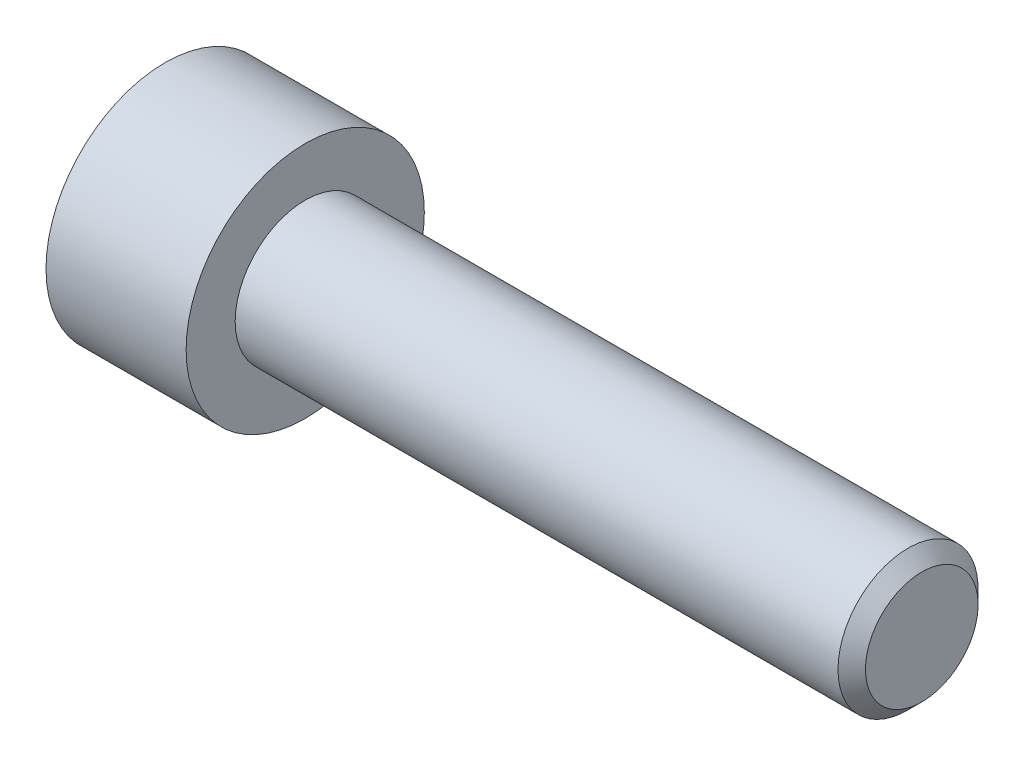
ISO-10303-21;
HEADER;
FILE_DESCRIPTION(('STEP AP214'),'2;1');
FILE_NAME('part.step','',(''),(''),'','','');
FILE_SCHEMA(('AUTOMOTIVE_DESIGN { 1 0 10303 214 1 1 1 1 }'));
ENDSEC;
DATA;
#1=APPLICATION_CONTEXT('core data for automotive mechanical design processes');
#2=APPLICATION_PROTOCOL_DEFINITION('international standard','automotive_design',2000,#1);
#3=PRODUCT_CONTEXT('',#1,'mechanical');
#4=PRODUCT('Part','Part','',(#3));
#5=PRODUCT_RELATED_PRODUCT_CATEGORY('part','',(#4));
#6=PRODUCT_DEFINITION_FORMATION('','',#4);
#7=PRODUCT_DEFINITION_CONTEXT('part definition',#1,'design');
#8=PRODUCT_DEFINITION('design','',#6,#7);
#9=PRODUCT_DEFINITION_SHAPE('','',#8);
#10=(LENGTH_UNIT() NAMED_UNIT(*) SI_UNIT(.MILLI.,.METRE.));
#11=(NAMED_UNIT(*) PLANE_ANGLE_UNIT() SI_UNIT($,.RADIAN.));
#12=(NAMED_UNIT(*) SI_UNIT($,.STERADIAN.) SOLID_ANGLE_UNIT());
#13=UNCERTAINTY_MEASURE_WITH_UNIT(LENGTH_MEASURE(1.E-05),#10,'distance_accuracy_value','');
#14=(GEOMETRIC_REPRESENTATION_CONTEXT(3) GLOBAL_UNCERTAINTY_ASSIGNED_CONTEXT((#13)) GLOBAL_UNIT_ASSIGNED_CONTEXT((#10,
#11,#12)) REPRESENTATION_CONTEXT('',''));
#15=CARTESIAN_POINT('',(0.,0.,0.));
#16=DIRECTION('',(0.,0.,1.));
#17=DIRECTION('',(1.,0.,0.));
#18=AXIS2_PLACEMENT_3D('',#15,#16,#17);
#19=CARTESIAN_POINT('',(-2.5,0.,0.));
#20=DIRECTION('',(1.,0.,0.));
#21=DIRECTION('',(0.,0.,-1.));
#22=AXIS2_PLACEMENT_3D('',#19,#20,#21);
#23=PLANE('',#22);
#24=DIRECTION('',(0.,-0.5,-0.866025403784439));
#25=VECTOR('',#24,1.);
#26=CARTESIAN_POINT('',(-2.5,-1.15470053837925,2.));
#27=LINE('',#26,#25);
#28=CARTESIAN_POINT('',(-2.5,-1.15470053837925,2.));
#29=VERTEX_POINT('',#28);
#30=CARTESIAN_POINT('',(-2.49999999999886,-1.73205080757302,1.00000000000238));
#31=VERTEX_POINT('',#30);
#32=EDGE_CURVE('E93',#29,#31,#27,.T.);
#33=ORIENTED_EDGE('',*,*,#32,.F.);
#34=DIRECTION('',(0.,1.,0.));
#35=VECTOR('',#34,1.);
#36=CARTESIAN_POINT('',(-2.5,0.,2.));
#37=LINE('',#36,#35);
#38=CARTESIAN_POINT('',(-2.49999999999886,0.,2.00000000000477));
#39=VERTEX_POINT('',#38);
#40=EDGE_CURVE('E89',#39,#29,#37,.F.);
#41=ORIENTED_EDGE('',*,*,#40,.F.);
#42=CARTESIAN_POINT('',(-2.49999999999773,0.,0.));
#43=DIRECTION('',(-1.,0.,0.));
#44=DIRECTION('',(0.,0.,1.));
#45=AXIS2_PLACEMENT_3D('',#42,#43,#44);
#46=CIRCLE('',#45,2.00000000000955);
#47=EDGE_CURVE('E20',#39,#31,#46,.F.);
#48=ORIENTED_EDGE('',*,*,#47,.T.);
#49=EDGE_LOOP('',(#33,#41,#48));
#50=FACE_BOUND('',#49,.T.);
#51=ADVANCED_FACE('F17',(#50),#23,.F.);
#52=CARTESIAN_POINT('',(-2.5,0.,0.));
#53=DIRECTION('',(1.,0.,0.));
#54=DIRECTION('',(0.,0.,-1.));
#55=AXIS2_PLACEMENT_3D('',#52,#53,#54);
#56=PLANE('',#55);
#57=DIRECTION('',(0.,0.499999999999999,-0.866025403784439));
#58=VECTOR('',#57,1.);
#59=CARTESIAN_POINT('',(-2.5,-2.3094010767585,0.));
#60=LINE('',#59,#58);
#61=CARTESIAN_POINT('',(-2.5,-2.3094010767585,0.));
#62=VERTEX_POINT('',#61);
#63=CARTESIAN_POINT('',(-2.49999999999886,-1.73205080757301,-1.0000000000024));
#64=VERTEX_POINT('',#63);
#65=EDGE_CURVE('E163',#62,#64,#60,.T.);
#66=ORIENTED_EDGE('',*,*,#65,.F.);
#67=DIRECTION('',(0.,-0.5,-0.866025403784439));
#68=VECTOR('',#67,1.);
#69=CARTESIAN_POINT('',(-2.5,-1.73205080756888,0.999999999999991));
#70=LINE('',#69,#68);
#71=EDGE_CURVE('E167',#31,#62,#70,.T.);
#72=ORIENTED_EDGE('',*,*,#71,.F.);
#73=CARTESIAN_POINT('',(-2.49999999999773,0.,0.));
#74=DIRECTION('',(-1.,0.,0.));
#75=DIRECTION('',(0.,0.,1.));
#76=AXIS2_PLACEMENT_3D('',#73,#74,#75);
#77=CIRCLE('',#76,2.00000000000955);
#78=EDGE_CURVE('E108',#31,#64,#77,.F.);
#79=ORIENTED_EDGE('',*,*,#78,.T.);
#80=EDGE_LOOP('',(#66,#72,#79));
#81=FACE_BOUND('',#80,.T.);
#82=ADVANCED_FACE('F210',(#81),#56,.F.);
#83=CARTESIAN_POINT('',(-2.5,0.,0.));
#84=DIRECTION('',(1.,0.,0.));
#85=DIRECTION('',(0.,0.,-1.));
#86=AXIS2_PLACEMENT_3D('',#83,#84,#85);
#87=PLANE('',#86);
#88=DIRECTION('',(0.,1.,0.));
#89=VECTOR('',#88,1.);
#90=CARTESIAN_POINT('',(-2.5,0.,-2.));
#91=LINE('',#90,#89);
#92=CARTESIAN_POINT('',(-2.5,-1.15470053837925,-2.));
#93=VERTEX_POINT('',#92);
#94=CARTESIAN_POINT('',(-2.49999999999886,0.,-2.00000000000477));
#95=VERTEX_POINT('',#94);
#96=EDGE_CURVE('E109',#93,#95,#91,.T.);
#97=ORIENTED_EDGE('',*,*,#96,.F.);
#98=DIRECTION('',(0.,0.5,-0.866025403784439));
#99=VECTOR('',#98,1.);
#100=CARTESIAN_POINT('',(-2.5,-1.73205080756887,-1.00000000000001));
#101=LINE('',#100,#99);
#102=EDGE_CURVE('E159',#64,#93,#101,.T.);
#103=ORIENTED_EDGE('',*,*,#102,.F.);
#104=CARTESIAN_POINT('',(-2.49999999999773,0.,0.));
#105=DIRECTION('',(-1.,0.,0.));
#106=DIRECTION('',(0.,0.,1.));
#107=AXIS2_PLACEMENT_3D('',#104,#105,#106);
#108=CIRCLE('',#107,2.00000000000955);
#109=EDGE_CURVE('E144',#64,#95,#108,.F.);
#110=ORIENTED_EDGE('',*,*,#109,.T.);
#111=EDGE_LOOP('',(#97,#103,#110));
#112=FACE_BOUND('',#111,.T.);
#113=ADVANCED_FACE('F213',(#112),#87,.F.);
#114=CARTESIAN_POINT('',(-2.5,0.,0.));
#115=DIRECTION('',(1.,0.,0.));
#116=DIRECTION('',(0.,0.,-1.));
#117=AXIS2_PLACEMENT_3D('',#114,#115,#116);
#118=PLANE('',#117);
#119=DIRECTION('',(0.,0.5,0.866025403784439));
#120=VECTOR('',#119,1.);
#121=CARTESIAN_POINT('',(-2.5,1.15470053837925,-2.));
#122=LINE('',#121,#120);
#123=CARTESIAN_POINT('',(-2.5,1.15470053837925,-2.));
#124=VERTEX_POINT('',#123);
#125=CARTESIAN_POINT('',(-2.49999999999886,1.73205080757302,-1.00000000000238));
#126=VERTEX_POINT('',#125);
#127=EDGE_CURVE('E136',#124,#126,#122,.T.);
#128=ORIENTED_EDGE('',*,*,#127,.F.);
#129=DIRECTION('',(0.,1.,0.));
#130=VECTOR('',#129,1.);
#131=CARTESIAN_POINT('',(-2.5,0.,-2.));
#132=LINE('',#131,#130);
#133=EDGE_CURVE('E140',#95,#124,#132,.T.);
#134=ORIENTED_EDGE('',*,*,#133,.F.);
#135=CARTESIAN_POINT('',(-2.49999999999773,0.,0.));
#136=DIRECTION('',(-1.,0.,0.));
#137=DIRECTION('',(0.,0.,1.));
#138=AXIS2_PLACEMENT_3D('',#135,#136,#137);
#139=CIRCLE('',#138,2.00000000000955);
#140=EDGE_CURVE('E131',#95,#126,#139,.F.);
#141=ORIENTED_EDGE('',*,*,#140,.T.);
#142=EDGE_LOOP('',(#128,#134,#141));
#143=FACE_BOUND('',#142,.T.);
#144=ADVANCED_FACE('F220',(#143),#118,.F.);
#145=CARTESIAN_POINT('',(-2.5,0.,0.));
#146=DIRECTION('',(1.,0.,0.));
#147=DIRECTION('',(0.,0.,-1.));
#148=AXIS2_PLACEMENT_3D('',#145,#146,#147);
#149=PLANE('',#148);
#150=CARTESIAN_POINT('',(-2.49999999999773,0.,0.));
#151=DIRECTION('',(-1.,0.,0.));
#152=DIRECTION('',(0.,0.,1.));
#153=AXIS2_PLACEMENT_3D('',#150,#151,#152);
#154=CIRCLE('',#153,2.00000000000955);
#155=CARTESIAN_POINT('',(-2.49999999999886,1.73205080757301,1.0000000000024));
#156=VERTEX_POINT('',#155);
#157=EDGE_CURVE('E116',#126,#156,#154,.F.);
#158=ORIENTED_EDGE('',*,*,#157,.T.);
#159=DIRECTION('',(0.,-0.499999999999999,0.866025403784439));
#160=VECTOR('',#159,1.);
#161=CARTESIAN_POINT('',(-2.5,2.3094010767585,0.));
#162=LINE('',#161,#160);
#163=CARTESIAN_POINT('',(-2.5,2.3094010767585,0.));
#164=VERTEX_POINT('',#163);
#165=EDGE_CURVE('E132',#164,#156,#162,.T.);
#166=ORIENTED_EDGE('',*,*,#165,.F.);
#167=DIRECTION('',(0.,0.499999999999999,0.866025403784439));
#168=VECTOR('',#167,1.);
#169=CARTESIAN_POINT('',(-2.5,1.73205080756888,-0.999999999999991));
#170=LINE('',#169,#168);
#171=EDGE_CURVE('E129',#126,#164,#170,.T.);
#172=ORIENTED_EDGE('',*,*,#171,.F.);
#173=EDGE_LOOP('',(#158,#166,#172));
#174=FACE_BOUND('',#173,.T.);
#175=ADVANCED_FACE('F223',(#174),#149,.F.);
#176=CARTESIAN_POINT('',(-2.49999999999773,0.,0.));
#177=DIRECTION('',(-1.,0.,0.));
#178=DIRECTION('',(0.,0.,1.));
#179=AXIS2_PLACEMENT_3D('',#176,#177,#178);
#180=CONICAL_SURFACE('',#179,2.00000000000955,1.30899693893931);
#181=CARTESIAN_POINT('',(-1.96410161511551,0.,5.11590769747272E-10));
#182=VERTEX_POINT('',#181);
#183=VERTEX_LOOP('',#182);
#184=FACE_BOUND('',#183,.T.);
#185=ORIENTED_EDGE('',*,*,#157,.F.);
#186=ORIENTED_EDGE('',*,*,#140,.F.);
#187=ORIENTED_EDGE('',*,*,#109,.F.);
#188=ORIENTED_EDGE('',*,*,#78,.F.);
#189=ORIENTED_EDGE('',*,*,#47,.F.);
#190=CARTESIAN_POINT('',(-2.49999999999773,0.,0.));
#191=DIRECTION('',(-1.,0.,0.));
#192=DIRECTION('',(0.,0.,1.));
#193=AXIS2_PLACEMENT_3D('',#190,#191,#192);
#194=CIRCLE('',#193,2.00000000000955);
#195=EDGE_CURVE('E104',#39,#156,#194,.T.);
#196=ORIENTED_EDGE('',*,*,#195,.T.);
#197=EDGE_LOOP('',(#185,#186,#187,#188,#189,#196));
#198=FACE_BOUND('',#197,.T.);
#199=ADVANCED_FACE('F103',(#184,#198),#180,.F.);
#200=CARTESIAN_POINT('',(-2.5,0.,0.));
#201=DIRECTION('',(1.,0.,0.));
#202=DIRECTION('',(0.,0.,-1.));
#203=AXIS2_PLACEMENT_3D('',#200,#201,#202);
#204=PLANE('',#203);
#205=DIRECTION('',(0.,1.,0.));
#206=VECTOR('',#205,1.);
#207=CARTESIAN_POINT('',(-2.5,1.15470053837925,2.));
#208=LINE('',#207,#206);
#209=CARTESIAN_POINT('',(-2.5,1.15470053837925,2.));
#210=VERTEX_POINT('',#209);
#211=EDGE_CURVE('E112',#210,#39,#208,.F.);
#212=ORIENTED_EDGE('',*,*,#211,.F.);
#213=DIRECTION('',(0.,0.5,-0.866025403784439));
#214=VECTOR('',#213,1.);
#215=CARTESIAN_POINT('',(-2.5,2.3094010767585,0.));
#216=LINE('',#215,#214);
#217=EDGE_CURVE('E115',#156,#210,#216,.F.);
#218=ORIENTED_EDGE('',*,*,#217,.F.);
#219=ORIENTED_EDGE('',*,*,#195,.F.);
#220=EDGE_LOOP('',(#212,#218,#219));
#221=FACE_BOUND('',#220,.T.);
#222=ADVANCED_FACE('F111',(#221),#204,.F.);
#223=CARTESIAN_POINT('',(-2.5,1.15470053837925,2.));
#224=DIRECTION('',(0.,0.,-1.));
#225=DIRECTION('',(-1.,0.,0.));
#226=AXIS2_PLACEMENT_3D('',#223,#224,#225);
#227=PLANE('',#226);
#228=ORIENTED_EDGE('',*,*,#40,.T.);
#229=DIRECTION('',(1.,0.,0.));
#230=VECTOR('',#229,1.);
#231=CARTESIAN_POINT('',(-2.5,-1.15470053837925,2.));
#232=LINE('',#231,#230);
#233=CARTESIAN_POINT('',(-5.,-1.15470053837925,2.));
#234=VERTEX_POINT('',#233);
#235=EDGE_CURVE('E179',#234,#29,#232,.T.);
#236=ORIENTED_EDGE('',*,*,#235,.F.);
#237=DIRECTION('',(0.,1.,0.));
#238=VECTOR('',#237,1.);
#239=CARTESIAN_POINT('',(-5.,0.,2.));
#240=LINE('',#239,#238);
#241=CARTESIAN_POINT('',(-5.,1.15470053837925,2.));
#242=VERTEX_POINT('',#241);
#243=EDGE_CURVE('E184',#234,#242,#240,.T.);
#244=ORIENTED_EDGE('',*,*,#243,.T.);
#245=DIRECTION('',(1.,0.,0.));
#246=VECTOR('',#245,1.);
#247=CARTESIAN_POINT('',(-2.5,1.15470053837925,2.));
#248=LINE('',#247,#246);
#249=EDGE_CURVE('E120',#210,#242,#248,.F.);
#250=ORIENTED_EDGE('',*,*,#249,.F.);
#251=ORIENTED_EDGE('',*,*,#211,.T.);
#252=EDGE_LOOP('',(#228,#236,#244,#250,#251));
#253=FACE_BOUND('',#252,.T.);
#254=ADVANCED_FACE('F118',(#253),#227,.T.);
#255=CARTESIAN_POINT('',(-2.5,2.3094010767585,0.));
#256=DIRECTION('',(0.,-0.866025403784439,-0.5));
#257=DIRECTION('',(0.,0.5,-0.866025403784439));
#258=AXIS2_PLACEMENT_3D('',#255,#256,#257);
#259=PLANE('',#258);
#260=ORIENTED_EDGE('',*,*,#217,.T.);
#261=ORIENTED_EDGE('',*,*,#249,.T.);
#262=DIRECTION('',(0.,0.499999999999999,-0.866025403784439));
#263=VECTOR('',#262,1.);
#264=CARTESIAN_POINT('',(-5.,1.15470053837925,2.));
#265=LINE('',#264,#263);
#266=CARTESIAN_POINT('',(-5.,2.3094010767585,0.));
#267=VERTEX_POINT('',#266);
#268=EDGE_CURVE('E232',#242,#267,#265,.T.);
#269=ORIENTED_EDGE('',*,*,#268,.T.);
#270=DIRECTION('',(1.,0.,0.));
#271=VECTOR('',#270,1.);
#272=CARTESIAN_POINT('',(-2.5,2.3094010767585,0.));
#273=LINE('',#272,#271);
#274=EDGE_CURVE('E147',#164,#267,#273,.F.);
#275=ORIENTED_EDGE('',*,*,#274,.F.);
#276=ORIENTED_EDGE('',*,*,#165,.T.);
#277=EDGE_LOOP('',(#260,#261,#269,#275,#276));
#278=FACE_BOUND('',#277,.T.);
#279=ADVANCED_FACE('F230',(#278),#259,.T.);
#280=CARTESIAN_POINT('',(-2.5,1.15470053837925,-2.));
#281=DIRECTION('',(0.,-0.866025403784439,0.5));
#282=DIRECTION('',(0.,-0.5,-0.866025403784439));
#283=AXIS2_PLACEMENT_3D('',#280,#281,#282);
#284=PLANE('',#283);
#285=ORIENTED_EDGE('',*,*,#171,.T.);
#286=ORIENTED_EDGE('',*,*,#274,.T.);
#287=DIRECTION('',(0.,-0.5,-0.866025403784439));
#288=VECTOR('',#287,1.);
#289=CARTESIAN_POINT('',(-5.,2.3094010767585,0.));
#290=LINE('',#289,#288);
#291=CARTESIAN_POINT('',(-5.,1.15470053837925,-2.));
#292=VERTEX_POINT('',#291);
#293=EDGE_CURVE('E235',#267,#292,#290,.T.);
#294=ORIENTED_EDGE('',*,*,#293,.T.);
#295=DIRECTION('',(1.,0.,0.));
#296=VECTOR('',#295,1.);
#297=CARTESIAN_POINT('',(-2.5,1.15470053837925,-2.));
#298=LINE('',#297,#296);
#299=EDGE_CURVE('E150',#124,#292,#298,.F.);
#300=ORIENTED_EDGE('',*,*,#299,.F.);
#301=ORIENTED_EDGE('',*,*,#127,.T.);
#302=EDGE_LOOP('',(#285,#286,#294,#300,#301));
#303=FACE_BOUND('',#302,.T.);
#304=ADVANCED_FACE('F226',(#303),#284,.T.);
#305=CARTESIAN_POINT('',(-2.5,-1.15470053837925,-2.));
#306=DIRECTION('',(0.,0.,1.));
#307=DIRECTION('',(1.,0.,0.));
#308=AXIS2_PLACEMENT_3D('',#305,#306,#307);
#309=PLANE('',#308);
#310=ORIENTED_EDGE('',*,*,#133,.T.);
#311=ORIENTED_EDGE('',*,*,#299,.T.);
#312=DIRECTION('',(0.,1.,0.));
#313=VECTOR('',#312,1.);
#314=CARTESIAN_POINT('',(-5.,0.,-2.));
#315=LINE('',#314,#313);
#316=CARTESIAN_POINT('',(-5.,-1.15470053837925,-2.));
#317=VERTEX_POINT('',#316);
#318=EDGE_CURVE('E237',#292,#317,#315,.F.);
#319=ORIENTED_EDGE('',*,*,#318,.T.);
#320=DIRECTION('',(1.,0.,0.));
#321=VECTOR('',#320,1.);
#322=CARTESIAN_POINT('',(-2.5,-1.15470053837925,-2.));
#323=LINE('',#322,#321);
#324=EDGE_CURVE('E155',#93,#317,#323,.F.);
#325=ORIENTED_EDGE('',*,*,#324,.F.);
#326=ORIENTED_EDGE('',*,*,#96,.T.);
#327=EDGE_LOOP('',(#310,#311,#319,#325,#326));
#328=FACE_BOUND('',#327,.T.);
#329=ADVANCED_FACE('F336',(#328),#309,.T.);
#330=CARTESIAN_POINT('',(-2.5,-2.3094010767585,0.));
#331=DIRECTION('',(0.,0.866025403784439,0.5));
#332=DIRECTION('',(0.,-0.5,0.866025403784439));
#333=AXIS2_PLACEMENT_3D('',#330,#331,#332);
#334=PLANE('',#333);
#335=ORIENTED_EDGE('',*,*,#102,.T.);
#336=ORIENTED_EDGE('',*,*,#324,.T.);
#337=DIRECTION('',(0.,-0.499999999999999,0.866025403784439));
#338=VECTOR('',#337,1.);
#339=CARTESIAN_POINT('',(-5.,-1.15470053837925,-2.));
#340=LINE('',#339,#338);
#341=CARTESIAN_POINT('',(-5.,-2.3094010767585,0.));
#342=VERTEX_POINT('',#341);
#343=EDGE_CURVE('E35',#317,#342,#340,.T.);
#344=ORIENTED_EDGE('',*,*,#343,.T.);
#345=DIRECTION('',(1.,0.,0.));
#346=VECTOR('',#345,1.);
#347=CARTESIAN_POINT('',(-2.5,-2.3094010767585,0.));
#348=LINE('',#347,#346);
#349=EDGE_CURVE('E182',#62,#342,#348,.F.);
#350=ORIENTED_EDGE('',*,*,#349,.F.);
#351=ORIENTED_EDGE('',*,*,#65,.T.);
#352=EDGE_LOOP('',(#335,#336,#344,#350,#351));
#353=FACE_BOUND('',#352,.T.);
#354=ADVANCED_FACE('F327',(#353),#334,.T.);
#355=CARTESIAN_POINT('',(-2.5,-1.15470053837925,2.));
#356=DIRECTION('',(0.,0.866025403784439,-0.5));
#357=DIRECTION('',(0.,0.5,0.866025403784439));
#358=AXIS2_PLACEMENT_3D('',#355,#356,#357);
#359=PLANE('',#358);
#360=ORIENTED_EDGE('',*,*,#71,.T.);
#361=ORIENTED_EDGE('',*,*,#349,.T.);
#362=DIRECTION('',(0.,0.5,0.866025403784439));
#363=VECTOR('',#362,1.);
#364=CARTESIAN_POINT('',(-5.,-2.3094010767585,0.));
#365=LINE('',#364,#363);
#366=EDGE_CURVE('E200',#342,#234,#365,.T.);
#367=ORIENTED_EDGE('',*,*,#366,.T.);
#368=ORIENTED_EDGE('',*,*,#235,.T.);
#369=ORIENTED_EDGE('',*,*,#32,.T.);
#370=EDGE_LOOP('',(#360,#361,#367,#368,#369));
#371=FACE_BOUND('',#370,.T.);
#372=ADVANCED_FACE('F248',(#371),#359,.T.);
#373=CARTESIAN_POINT('',(-5.,0.,0.));
#374=DIRECTION('',(1.,0.,0.));
#375=DIRECTION('',(0.,0.,-1.));
#376=AXIS2_PLACEMENT_3D('',#373,#374,#375);
#377=PLANE('',#376);
#378=ORIENTED_EDGE('',*,*,#343,.F.);
#379=ORIENTED_EDGE('',*,*,#318,.F.);
#380=ORIENTED_EDGE('',*,*,#293,.F.);
#381=ORIENTED_EDGE('',*,*,#268,.F.);
#382=ORIENTED_EDGE('',*,*,#243,.F.);
#383=ORIENTED_EDGE('',*,*,#366,.F.);
#384=EDGE_LOOP('',(#378,#379,#380,#381,#382,#383));
#385=FACE_BOUND('',#384,.T.);
#386=CARTESIAN_POINT('',(-5.,0.,0.));
#387=DIRECTION('',(-1.,0.,0.));
#388=DIRECTION('',(0.,0.,1.));
#389=AXIS2_PLACEMENT_3D('',#386,#387,#388);
#390=CIRCLE('',#389,4.25);
#391=CARTESIAN_POINT('',(-5.,0.,4.25));
#392=VERTEX_POINT('',#391);
#393=EDGE_CURVE('E198',#392,#392,#390,.F.);
#394=ORIENTED_EDGE('',*,*,#393,.F.);
#395=EDGE_LOOP('',(#394));
#396=FACE_BOUND('',#395,.T.);
#397=ADVANCED_FACE('F249',(#385,#396),#377,.F.);
#398=CARTESIAN_POINT('',(22.,0.,0.));
#399=DIRECTION('',(-1.,0.,0.));
#400=DIRECTION('',(0.,0.,1.));
#401=AXIS2_PLACEMENT_3D('',#398,#399,#400);
#402=CYLINDRICAL_SURFACE('',#401,4.25);
#403=ORIENTED_EDGE('',*,*,#393,.T.);
#404=EDGE_LOOP('',(#403));
#405=FACE_BOUND('',#404,.T.);
#406=CARTESIAN_POINT('',(0.,0.,0.));
#407=DIRECTION('',(-1.,0.,0.));
#408=DIRECTION('',(0.,0.,1.));
#409=AXIS2_PLACEMENT_3D('',#406,#407,#408);
#410=CIRCLE('',#409,4.25);
#411=CARTESIAN_POINT('',(0.,0.,4.25));
#412=VERTEX_POINT('',#411);
#413=EDGE_CURVE('E195',#412,#412,#410,.T.);
#414=ORIENTED_EDGE('',*,*,#413,.T.);
#415=EDGE_LOOP('',(#414));
#416=FACE_BOUND('',#415,.T.);
#417=ADVANCED_FACE('F253',(#405,#416),#402,.T.);
#418=CARTESIAN_POINT('',(22.,2.0095,0.));
#419=DIRECTION('',(-1.,0.,0.));
#420=DIRECTION('',(0.,0.,1.));
#421=AXIS2_PLACEMENT_3D('',#418,#419,#420);
#422=PLANE('',#421);
#423=CARTESIAN_POINT('',(22.0000000000482,0.,0.));
#424=DIRECTION('',(-1.,0.,0.));
#425=DIRECTION('',(0.,0.,1.));
#426=AXIS2_PLACEMENT_3D('',#423,#424,#425);
#427=CIRCLE('',#426,2.00949999998556);
#428=CARTESIAN_POINT('',(22.0000000000482,0.,2.00949999998556));
#429=VERTEX_POINT('',#428);
#430=EDGE_CURVE('E192',#429,#429,#427,.T.);
#431=ORIENTED_EDGE('',*,*,#430,.F.);
#432=EDGE_LOOP('',(#431));
#433=FACE_BOUND('',#432,.T.);
#434=ADVANCED_FACE('F259',(#433),#422,.F.);
#435=CARTESIAN_POINT('',(0.,4.25,0.));
#436=DIRECTION('',(-1.,0.,0.));
#437=DIRECTION('',(0.,0.,1.));
#438=AXIS2_PLACEMENT_3D('',#435,#436,#437);
#439=PLANE('',#438);
#440=CARTESIAN_POINT('',(0.,0.,0.));
#441=DIRECTION('',(-1.,0.,0.));
#442=DIRECTION('',(0.,0.,1.));
#443=AXIS2_PLACEMENT_3D('',#440,#441,#442);
#444=CIRCLE('',#443,2.5);
#445=CARTESIAN_POINT('',(0.,0.,2.5));
#446=VERTEX_POINT('',#445);
#447=EDGE_CURVE('E26',#446,#446,#444,.F.);
#448=ORIENTED_EDGE('',*,*,#447,.F.);
#449=EDGE_LOOP('',(#448));
#450=FACE_BOUND('',#449,.T.);
#451=ORIENTED_EDGE('',*,*,#413,.F.);
#452=EDGE_LOOP('',(#451));
#453=FACE_BOUND('',#452,.T.);
#454=ADVANCED_FACE('F263',(#450,#453),#439,.F.);
#455=CARTESIAN_POINT('',(21.509500000036,0.,0.));
#456=DIRECTION('',(-1.,0.,0.));
#457=DIRECTION('',(0.,0.,1.));
#458=AXIS2_PLACEMENT_3D('',#455,#456,#457);
#459=CONICAL_SURFACE('',#458,2.49999999999773,0.785398163397448);
#460=ORIENTED_EDGE('',*,*,#430,.T.);
#461=EDGE_LOOP('',(#460));
#462=FACE_BOUND('',#461,.T.);
#463=CARTESIAN_POINT('',(21.5095,0.,0.));
#464=DIRECTION('',(-1.,0.,0.));
#465=DIRECTION('',(0.,0.,1.));
#466=AXIS2_PLACEMENT_3D('',#463,#464,#465);
#467=CIRCLE('',#466,2.5);
#468=CARTESIAN_POINT('',(21.5095,0.,2.5));
#469=VERTEX_POINT('',#468);
#470=EDGE_CURVE('E11',#469,#469,#467,.T.);
#471=ORIENTED_EDGE('',*,*,#470,.F.);
#472=EDGE_LOOP('',(#471));
#473=FACE_BOUND('',#472,.T.);
#474=ADVANCED_FACE('F265',(#462,#473),#459,.T.);
#475=CARTESIAN_POINT('',(22.,0.,0.));
#476=DIRECTION('',(-1.,0.,0.));
#477=DIRECTION('',(0.,0.,1.));
#478=AXIS2_PLACEMENT_3D('',#475,#476,#477);
#479=CYLINDRICAL_SURFACE('',#478,2.5);
#480=ORIENTED_EDGE('',*,*,#470,.T.);
#481=EDGE_LOOP('',(#480));
#482=FACE_BOUND('',#481,.T.);
#483=ORIENTED_EDGE('',*,*,#447,.T.);
#484=EDGE_LOOP('',(#483));
#485=FACE_BOUND('',#484,.T.);
#486=ADVANCED_FACE('F273',(#482,#485),#479,.T.);
#487=CLOSED_SHELL('',(#51,#82,#113,#144,#175,#199,#222,#254,#279,#304,#329,#354,#372,#397,#417,
#434,#454,#474,#486));
#488=MANIFOLD_SOLID_BREP('B1',#487);
#489=ADVANCED_BREP_SHAPE_REPRESENTATION('',(#18,#488),#14);
#490=SHAPE_DEFINITION_REPRESENTATION(#9,#489);
ENDSEC;
END-ISO-10303-21;
